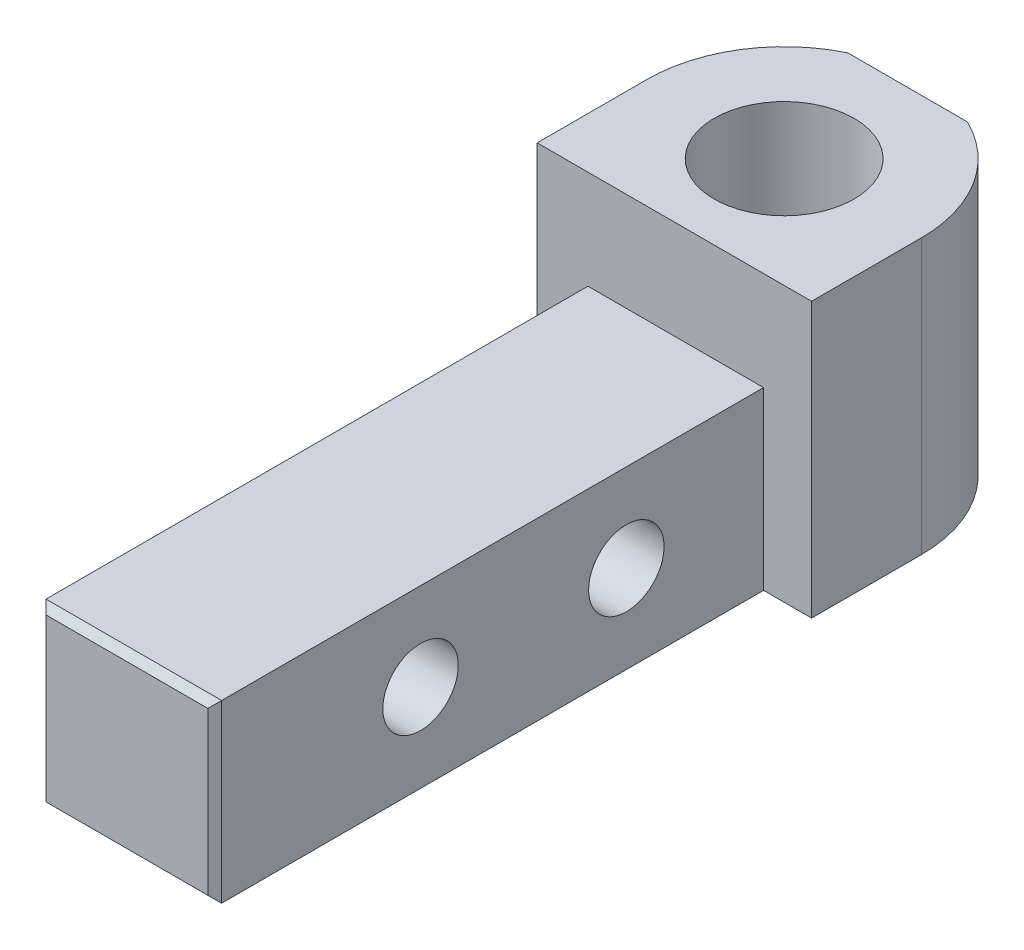
ISO-10303-21;
HEADER;
FILE_DESCRIPTION(('STEP AP214'),'2;1');
FILE_NAME('part.step','',(''),(''),'','','');
FILE_SCHEMA(('AUTOMOTIVE_DESIGN { 1 0 10303 214 1 1 1 1 }'));
ENDSEC;
DATA;
#1=APPLICATION_CONTEXT('core data for automotive mechanical design processes');
#2=APPLICATION_PROTOCOL_DEFINITION('international standard','automotive_design',2000,#1);
#3=PRODUCT_CONTEXT('',#1,'mechanical');
#4=PRODUCT('Part','Part','',(#3));
#5=PRODUCT_RELATED_PRODUCT_CATEGORY('part','',(#4));
#6=PRODUCT_DEFINITION_FORMATION('','',#4);
#7=PRODUCT_DEFINITION_CONTEXT('part definition',#1,'design');
#8=PRODUCT_DEFINITION('design','',#6,#7);
#9=PRODUCT_DEFINITION_SHAPE('','',#8);
#10=(LENGTH_UNIT() NAMED_UNIT(*) SI_UNIT(.MILLI.,.METRE.));
#11=(NAMED_UNIT(*) PLANE_ANGLE_UNIT() SI_UNIT($,.RADIAN.));
#12=(NAMED_UNIT(*) SI_UNIT($,.STERADIAN.) SOLID_ANGLE_UNIT());
#13=UNCERTAINTY_MEASURE_WITH_UNIT(LENGTH_MEASURE(1.E-05),#10,'distance_accuracy_value','');
#14=(GEOMETRIC_REPRESENTATION_CONTEXT(3) GLOBAL_UNCERTAINTY_ASSIGNED_CONTEXT((#13)) GLOBAL_UNIT_ASSIGNED_CONTEXT((#10,
#11,#12)) REPRESENTATION_CONTEXT('',''));
#15=CARTESIAN_POINT('',(0.,0.,0.));
#16=DIRECTION('',(0.,0.,1.));
#17=DIRECTION('',(1.,0.,0.));
#18=AXIS2_PLACEMENT_3D('',#15,#16,#17);
#19=CARTESIAN_POINT('',(-6.3,-6.3,8.));
#20=DIRECTION('',(-1.,0.,0.));
#21=DIRECTION('',(0.,0.,-1.));
#22=AXIS2_PLACEMENT_3D('',#19,#20,#21);
#23=PLANE('',#22);
#24=CARTESIAN_POINT('',(-6.3,0.1,33.));
#25=DIRECTION('',(1.,0.,0.));
#26=DIRECTION('',(0.,0.,-1.));
#27=AXIS2_PLACEMENT_3D('',#24,#25,#26);
#28=CIRCLE('',#27,2.75);
#29=CARTESIAN_POINT('',(-6.3,0.1,30.25));
#30=VERTEX_POINT('',#29);
#31=EDGE_CURVE('E541',#30,#30,#28,.T.);
#32=ORIENTED_EDGE('',*,*,#31,.T.);
#33=EDGE_LOOP('',(#32));
#34=FACE_BOUND('',#33,.T.);
#35=CARTESIAN_POINT('',(-6.3,0.1,18.));
#36=DIRECTION('',(1.,0.,0.));
#37=DIRECTION('',(0.,0.,-1.));
#38=AXIS2_PLACEMENT_3D('',#35,#36,#37);
#39=CIRCLE('',#38,2.75);
#40=CARTESIAN_POINT('',(-6.3,0.1,15.25));
#41=VERTEX_POINT('',#40);
#42=EDGE_CURVE('E553',#41,#41,#39,.T.);
#43=ORIENTED_EDGE('',*,*,#42,.T.);
#44=EDGE_LOOP('',(#43));
#45=FACE_BOUND('',#44,.T.);
#46=DIRECTION('',(0.,0.,1.));
#47=VECTOR('',#46,1.);
#48=CARTESIAN_POINT('',(-6.3,6.5,8.));
#49=LINE('',#48,#47);
#50=CARTESIAN_POINT('',(-6.3,6.5,8.));
#51=VERTEX_POINT('',#50);
#52=CARTESIAN_POINT('',(-6.3,6.5,47.5));
#53=VERTEX_POINT('',#52);
#54=EDGE_CURVE('E153',#51,#53,#49,.T.);
#55=ORIENTED_EDGE('',*,*,#54,.F.);
#56=DIRECTION('',(0.,1.,0.));
#57=VECTOR('',#56,1.);
#58=CARTESIAN_POINT('',(-6.3,-6.3,8.));
#59=LINE('',#58,#57);
#60=CARTESIAN_POINT('',(-6.3,-6.3,8.));
#61=VERTEX_POINT('',#60);
#62=EDGE_CURVE('E147',#61,#51,#59,.T.);
#63=ORIENTED_EDGE('',*,*,#62,.F.);
#64=DIRECTION('',(0.,0.,-1.));
#65=VECTOR('',#64,1.);
#66=CARTESIAN_POINT('',(-6.3,-6.3,8.));
#67=LINE('',#66,#65);
#68=CARTESIAN_POINT('',(-6.3,-6.3,47.5));
#69=VERTEX_POINT('',#68);
#70=EDGE_CURVE('E604',#69,#61,#67,.T.);
#71=ORIENTED_EDGE('',*,*,#70,.F.);
#72=DIRECTION('',(0.,-1.,0.));
#73=VECTOR('',#72,1.);
#74=CARTESIAN_POINT('',(-6.3,-6.3,47.5));
#75=LINE('',#74,#73);
#76=EDGE_CURVE('E12',#53,#69,#75,.T.);
#77=ORIENTED_EDGE('',*,*,#76,.F.);
#78=EDGE_LOOP('',(#55,#63,#71,#77));
#79=FACE_BOUND('',#78,.T.);
#80=ADVANCED_FACE('F19',(#34,#45,#79),#23,.T.);
#81=CARTESIAN_POINT('',(-6.3,-6.3,48.));
#82=DIRECTION('',(0.,0.,1.));
#83=DIRECTION('',(-1.,0.,0.));
#84=AXIS2_PLACEMENT_3D('',#81,#82,#83);
#85=PLANE('',#84);
#86=DIRECTION('',(0.,-1.,0.));
#87=VECTOR('',#86,1.);
#88=CARTESIAN_POINT('',(6.,-6.3,48.));
#89=LINE('',#88,#87);
#90=CARTESIAN_POINT('',(6.,6.,48.));
#91=VERTEX_POINT('',#90);
#92=CARTESIAN_POINT('',(6.,-5.8,48.));
#93=VERTEX_POINT('',#92);
#94=EDGE_CURVE('E271',#91,#93,#89,.T.);
#95=ORIENTED_EDGE('',*,*,#94,.F.);
#96=DIRECTION('',(1.,0.,0.));
#97=VECTOR('',#96,1.);
#98=CARTESIAN_POINT('',(-6.3,6.,48.));
#99=LINE('',#98,#97);
#100=CARTESIAN_POINT('',(-5.8,6.,48.));
#101=VERTEX_POINT('',#100);
#102=EDGE_CURVE('E276',#101,#91,#99,.T.);
#103=ORIENTED_EDGE('',*,*,#102,.F.);
#104=DIRECTION('',(0.,1.,0.));
#105=VECTOR('',#104,1.);
#106=CARTESIAN_POINT('',(-5.8,-6.3,48.));
#107=LINE('',#106,#105);
#108=CARTESIAN_POINT('',(-5.8,-5.8,48.));
#109=VERTEX_POINT('',#108);
#110=EDGE_CURVE('E203',#109,#101,#107,.T.);
#111=ORIENTED_EDGE('',*,*,#110,.F.);
#112=DIRECTION('',(-1.,0.,0.));
#113=VECTOR('',#112,1.);
#114=CARTESIAN_POINT('',(-6.3,-5.8,48.));
#115=LINE('',#114,#113);
#116=EDGE_CURVE('E281',#93,#109,#115,.T.);
#117=ORIENTED_EDGE('',*,*,#116,.F.);
#118=EDGE_LOOP('',(#95,#103,#111,#117));
#119=FACE_BOUND('',#118,.T.);
#120=ADVANCED_FACE('F234',(#119),#85,.T.);
#121=CARTESIAN_POINT('',(6.5,-6.3,48.));
#122=DIRECTION('',(1.,0.,0.));
#123=DIRECTION('',(0.,0.,1.));
#124=AXIS2_PLACEMENT_3D('',#121,#122,#123);
#125=PLANE('',#124);
#126=CARTESIAN_POINT('',(6.5,0.1,33.));
#127=DIRECTION('',(-1.,0.,0.));
#128=DIRECTION('',(0.,0.,1.));
#129=AXIS2_PLACEMENT_3D('',#126,#127,#128);
#130=CIRCLE('',#129,2.75);
#131=CARTESIAN_POINT('',(6.5,0.1,35.75));
#132=VERTEX_POINT('',#131);
#133=EDGE_CURVE('E274',#132,#132,#130,.T.);
#134=ORIENTED_EDGE('',*,*,#133,.T.);
#135=EDGE_LOOP('',(#134));
#136=FACE_BOUND('',#135,.T.);
#137=CARTESIAN_POINT('',(6.5,0.1,18.));
#138=DIRECTION('',(-1.,0.,0.));
#139=DIRECTION('',(0.,0.,1.));
#140=AXIS2_PLACEMENT_3D('',#137,#138,#139);
#141=CIRCLE('',#140,2.75);
#142=CARTESIAN_POINT('',(6.5,0.1,20.75));
#143=VERTEX_POINT('',#142);
#144=EDGE_CURVE('E547',#143,#143,#141,.T.);
#145=ORIENTED_EDGE('',*,*,#144,.T.);
#146=EDGE_LOOP('',(#145));
#147=FACE_BOUND('',#146,.T.);
#148=DIRECTION('',(0.,0.,1.));
#149=VECTOR('',#148,1.);
#150=CARTESIAN_POINT('',(6.5,-6.3,48.));
#151=LINE('',#150,#149);
#152=CARTESIAN_POINT('',(6.5,-6.3,8.));
#153=VERTEX_POINT('',#152);
#154=CARTESIAN_POINT('',(6.5,-6.3,47.5));
#155=VERTEX_POINT('',#154);
#156=EDGE_CURVE('E166',#153,#155,#151,.T.);
#157=ORIENTED_EDGE('',*,*,#156,.F.);
#158=DIRECTION('',(0.,1.,0.));
#159=VECTOR('',#158,1.);
#160=CARTESIAN_POINT('',(6.5,-6.3,8.));
#161=LINE('',#160,#159);
#162=CARTESIAN_POINT('',(6.5,6.5,8.));
#163=VERTEX_POINT('',#162);
#164=EDGE_CURVE('E144',#153,#163,#161,.T.);
#165=ORIENTED_EDGE('',*,*,#164,.T.);
#166=DIRECTION('',(0.,0.,-1.));
#167=VECTOR('',#166,1.);
#168=CARTESIAN_POINT('',(6.5,6.5,8.));
#169=LINE('',#168,#167);
#170=CARTESIAN_POINT('',(6.5,6.5,47.5));
#171=VERTEX_POINT('',#170);
#172=EDGE_CURVE('E156',#171,#163,#169,.T.);
#173=ORIENTED_EDGE('',*,*,#172,.F.);
#174=DIRECTION('',(0.,1.,0.));
#175=VECTOR('',#174,1.);
#176=CARTESIAN_POINT('',(6.5,-6.3,47.5));
#177=LINE('',#176,#175);
#178=EDGE_CURVE('E272',#155,#171,#177,.T.);
#179=ORIENTED_EDGE('',*,*,#178,.F.);
#180=EDGE_LOOP('',(#157,#165,#173,#179));
#181=FACE_BOUND('',#180,.T.);
#182=ADVANCED_FACE('F164',(#136,#147,#181),#125,.T.);
#183=CARTESIAN_POINT('',(0.,-6.3,0.));
#184=DIRECTION('',(0.,1.,0.));
#185=DIRECTION('',(0.,0.,-1.));
#186=AXIS2_PLACEMENT_3D('',#183,#184,#185);
#187=CYLINDRICAL_SURFACE('',#186,10.);
#188=DIRECTION('',(0.,1.,0.));
#189=VECTOR('',#188,1.);
#190=CARTESIAN_POINT('',(-4.35889894354067,-6.3,-9.));
#191=LINE('',#190,#189);
#192=CARTESIAN_POINT('',(-4.35889894354067,-6.3,-9.));
#193=VERTEX_POINT('',#192);
#194=CARTESIAN_POINT('',(-4.35889894354067,13.7,-9.));
#195=VERTEX_POINT('',#194);
#196=EDGE_CURVE('E187',#193,#195,#191,.T.);
#197=ORIENTED_EDGE('',*,*,#196,.F.);
#198=CARTESIAN_POINT('',(0.,-6.3,0.));
#199=DIRECTION('',(0.,-1.,0.));
#200=DIRECTION('',(0.,0.,-1.));
#201=AXIS2_PLACEMENT_3D('',#198,#199,#200);
#202=CIRCLE('',#201,10.);
#203=CARTESIAN_POINT('',(-10.,-6.3,0.));
#204=VERTEX_POINT('',#203);
#205=EDGE_CURVE('E586',#204,#193,#202,.T.);
#206=ORIENTED_EDGE('',*,*,#205,.F.);
#207=DIRECTION('',(0.,1.,0.));
#208=VECTOR('',#207,1.);
#209=CARTESIAN_POINT('',(-10.,-6.3,0.));
#210=LINE('',#209,#208);
#211=CARTESIAN_POINT('',(-10.,13.7,0.));
#212=VERTEX_POINT('',#211);
#213=EDGE_CURVE('E613',#204,#212,#210,.T.);
#214=ORIENTED_EDGE('',*,*,#213,.T.);
#215=CARTESIAN_POINT('',(0.,13.7,0.));
#216=DIRECTION('',(0.,-1.,0.));
#217=DIRECTION('',(0.,0.,-1.));
#218=AXIS2_PLACEMENT_3D('',#215,#216,#217);
#219=CIRCLE('',#218,10.);
#220=EDGE_CURVE('E152',#212,#195,#219,.T.);
#221=ORIENTED_EDGE('',*,*,#220,.T.);
#222=EDGE_LOOP('',(#197,#206,#214,#221));
#223=FACE_BOUND('',#222,.T.);
#224=ADVANCED_FACE('F227',(#223),#187,.T.);
#225=CARTESIAN_POINT('',(-10.,-6.3,0.));
#226=DIRECTION('',(-1.,0.,0.));
#227=DIRECTION('',(0.,0.,-1.));
#228=AXIS2_PLACEMENT_3D('',#225,#226,#227);
#229=PLANE('',#228);
#230=ORIENTED_EDGE('',*,*,#213,.F.);
#231=DIRECTION('',(0.,0.,-1.));
#232=VECTOR('',#231,1.);
#233=CARTESIAN_POINT('',(-10.,-6.3,0.));
#234=LINE('',#233,#232);
#235=CARTESIAN_POINT('',(-10.,-6.3,8.));
#236=VERTEX_POINT('',#235);
#237=EDGE_CURVE('E191',#236,#204,#234,.T.);
#238=ORIENTED_EDGE('',*,*,#237,.F.);
#239=DIRECTION('',(0.,1.,0.));
#240=VECTOR('',#239,1.);
#241=CARTESIAN_POINT('',(-10.,-6.3,8.));
#242=LINE('',#241,#240);
#243=CARTESIAN_POINT('',(-10.,13.7,8.));
#244=VERTEX_POINT('',#243);
#245=EDGE_CURVE('E173',#236,#244,#242,.T.);
#246=ORIENTED_EDGE('',*,*,#245,.T.);
#247=DIRECTION('',(0.,0.,-1.));
#248=VECTOR('',#247,1.);
#249=CARTESIAN_POINT('',(-10.,13.7,0.));
#250=LINE('',#249,#248);
#251=EDGE_CURVE('E583',#244,#212,#250,.T.);
#252=ORIENTED_EDGE('',*,*,#251,.T.);
#253=EDGE_LOOP('',(#230,#238,#246,#252));
#254=FACE_BOUND('',#253,.T.);
#255=ADVANCED_FACE('F224',(#254),#229,.T.);
#256=CARTESIAN_POINT('',(-10.,-6.3,8.));
#257=DIRECTION('',(0.,0.,1.));
#258=DIRECTION('',(-1.,0.,0.));
#259=AXIS2_PLACEMENT_3D('',#256,#257,#258);
#260=PLANE('',#259);
#261=ORIENTED_EDGE('',*,*,#245,.F.);
#262=DIRECTION('',(-1.,0.,0.));
#263=VECTOR('',#262,1.);
#264=CARTESIAN_POINT('',(-10.,-6.3,8.));
#265=LINE('',#264,#263);
#266=EDGE_CURVE('E608',#61,#236,#265,.T.);
#267=ORIENTED_EDGE('',*,*,#266,.F.);
#268=ORIENTED_EDGE('',*,*,#62,.T.);
#269=DIRECTION('',(-1.,0.,0.));
#270=VECTOR('',#269,1.);
#271=CARTESIAN_POINT('',(-6.3,6.5,8.));
#272=LINE('',#271,#270);
#273=EDGE_CURVE('E138',#163,#51,#272,.T.);
#274=ORIENTED_EDGE('',*,*,#273,.F.);
#275=ORIENTED_EDGE('',*,*,#164,.F.);
#276=DIRECTION('',(-1.,0.,0.));
#277=VECTOR('',#276,1.);
#278=CARTESIAN_POINT('',(6.5,-6.3,8.));
#279=LINE('',#278,#277);
#280=CARTESIAN_POINT('',(10.,-6.3,8.));
#281=VERTEX_POINT('',#280);
#282=EDGE_CURVE('E599',#281,#153,#279,.T.);
#283=ORIENTED_EDGE('',*,*,#282,.F.);
#284=DIRECTION('',(0.,1.,0.));
#285=VECTOR('',#284,1.);
#286=CARTESIAN_POINT('',(10.,-6.3,8.));
#287=LINE('',#286,#285);
#288=CARTESIAN_POINT('',(10.,13.7,8.));
#289=VERTEX_POINT('',#288);
#290=EDGE_CURVE('E168',#281,#289,#287,.T.);
#291=ORIENTED_EDGE('',*,*,#290,.T.);
#292=DIRECTION('',(-1.,0.,0.));
#293=VECTOR('',#292,1.);
#294=CARTESIAN_POINT('',(6.5,13.7,8.));
#295=LINE('',#294,#293);
#296=EDGE_CURVE('E580',#289,#244,#295,.T.);
#297=ORIENTED_EDGE('',*,*,#296,.T.);
#298=EDGE_LOOP('',(#261,#267,#268,#274,#275,#283,#291,#297));
#299=FACE_BOUND('',#298,.T.);
#300=ADVANCED_FACE('F141',(#299),#260,.T.);
#301=CARTESIAN_POINT('',(10.,-6.3,8.));
#302=DIRECTION('',(1.,0.,0.));
#303=DIRECTION('',(0.,0.,1.));
#304=AXIS2_PLACEMENT_3D('',#301,#302,#303);
#305=PLANE('',#304);
#306=ORIENTED_EDGE('',*,*,#290,.F.);
#307=DIRECTION('',(0.,0.,1.));
#308=VECTOR('',#307,1.);
#309=CARTESIAN_POINT('',(10.,-6.3,8.));
#310=LINE('',#309,#308);
#311=CARTESIAN_POINT('',(10.,-6.3,0.));
#312=VERTEX_POINT('',#311);
#313=EDGE_CURVE('E596',#312,#281,#310,.T.);
#314=ORIENTED_EDGE('',*,*,#313,.F.);
#315=DIRECTION('',(0.,1.,0.));
#316=VECTOR('',#315,1.);
#317=CARTESIAN_POINT('',(10.,-6.3,0.));
#318=LINE('',#317,#316);
#319=CARTESIAN_POINT('',(10.,13.7,0.));
#320=VERTEX_POINT('',#319);
#321=EDGE_CURVE('E176',#312,#320,#318,.T.);
#322=ORIENTED_EDGE('',*,*,#321,.T.);
#323=DIRECTION('',(0.,0.,1.));
#324=VECTOR('',#323,1.);
#325=CARTESIAN_POINT('',(10.,13.7,8.));
#326=LINE('',#325,#324);
#327=EDGE_CURVE('E577',#320,#289,#326,.T.);
#328=ORIENTED_EDGE('',*,*,#327,.T.);
#329=EDGE_LOOP('',(#306,#314,#322,#328));
#330=FACE_BOUND('',#329,.T.);
#331=ADVANCED_FACE('F231',(#330),#305,.T.);
#332=CARTESIAN_POINT('',(0.,-6.3,0.));
#333=DIRECTION('',(0.,1.,0.));
#334=DIRECTION('',(0.,0.,-1.));
#335=AXIS2_PLACEMENT_3D('',#332,#333,#334);
#336=CYLINDRICAL_SURFACE('',#335,10.);
#337=ORIENTED_EDGE('',*,*,#321,.F.);
#338=CARTESIAN_POINT('',(0.,-6.3,0.));
#339=DIRECTION('',(0.,-1.,0.));
#340=DIRECTION('',(0.,0.,1.));
#341=AXIS2_PLACEMENT_3D('',#338,#339,#340);
#342=CIRCLE('',#341,10.);
#343=CARTESIAN_POINT('',(4.35889894354067,-6.3,-9.));
#344=VERTEX_POINT('',#343);
#345=EDGE_CURVE('E593',#344,#312,#342,.T.);
#346=ORIENTED_EDGE('',*,*,#345,.F.);
#347=DIRECTION('',(0.,1.,0.));
#348=VECTOR('',#347,1.);
#349=CARTESIAN_POINT('',(4.35889894354067,-6.3,-9.));
#350=LINE('',#349,#348);
#351=CARTESIAN_POINT('',(4.35889894354067,13.7,-9.));
#352=VERTEX_POINT('',#351);
#353=EDGE_CURVE('E183',#344,#352,#350,.T.);
#354=ORIENTED_EDGE('',*,*,#353,.T.);
#355=CARTESIAN_POINT('',(0.,13.7,0.));
#356=DIRECTION('',(0.,-1.,0.));
#357=DIRECTION('',(0.,0.,1.));
#358=AXIS2_PLACEMENT_3D('',#355,#356,#357);
#359=CIRCLE('',#358,10.);
#360=EDGE_CURVE('E574',#352,#320,#359,.T.);
#361=ORIENTED_EDGE('',*,*,#360,.T.);
#362=EDGE_LOOP('',(#337,#346,#354,#361));
#363=FACE_BOUND('',#362,.T.);
#364=ADVANCED_FACE('F244',(#363),#336,.T.);
#365=CARTESIAN_POINT('',(-4.35889894354067,-6.3,-9.));
#366=DIRECTION('',(0.,0.,-1.));
#367=DIRECTION('',(1.,0.,0.));
#368=AXIS2_PLACEMENT_3D('',#365,#366,#367);
#369=PLANE('',#368);
#370=CARTESIAN_POINT('',(0.,0.,-9.));
#371=DIRECTION('',(0.,0.,1.));
#372=DIRECTION('',(1.,0.,0.));
#373=AXIS2_PLACEMENT_3D('',#370,#371,#372);
#374=CIRCLE('',#373,1.65);
#375=CARTESIAN_POINT('',(1.65,0.,-9.));
#376=VERTEX_POINT('',#375);
#377=EDGE_CURVE('E202',#376,#376,#374,.T.);
#378=ORIENTED_EDGE('',*,*,#377,.T.);
#379=EDGE_LOOP('',(#378));
#380=FACE_BOUND('',#379,.T.);
#381=ORIENTED_EDGE('',*,*,#353,.F.);
#382=DIRECTION('',(1.,0.,0.));
#383=VECTOR('',#382,1.);
#384=CARTESIAN_POINT('',(-4.35889894354067,-6.3,-9.));
#385=LINE('',#384,#383);
#386=EDGE_CURVE('E590',#193,#344,#385,.T.);
#387=ORIENTED_EDGE('',*,*,#386,.F.);
#388=ORIENTED_EDGE('',*,*,#196,.T.);
#389=DIRECTION('',(1.,0.,0.));
#390=VECTOR('',#389,1.);
#391=CARTESIAN_POINT('',(-4.35889894354067,13.7,-9.));
#392=LINE('',#391,#390);
#393=EDGE_CURVE('E571',#195,#352,#392,.T.);
#394=ORIENTED_EDGE('',*,*,#393,.T.);
#395=EDGE_LOOP('',(#381,#387,#388,#394));
#396=FACE_BOUND('',#395,.T.);
#397=ADVANCED_FACE('F222',(#380,#396),#369,.T.);
#398=CARTESIAN_POINT('',(0.,-6.3,0.));
#399=DIRECTION('',(0.,1.,0.));
#400=DIRECTION('',(0.,0.,-1.));
#401=AXIS2_PLACEMENT_3D('',#398,#399,#400);
#402=PLANE('',#401);
#403=CARTESIAN_POINT('',(0.,-6.3,0.));
#404=DIRECTION('',(0.,-1.,0.));
#405=DIRECTION('',(0.,0.,-1.));
#406=AXIS2_PLACEMENT_3D('',#403,#404,#405);
#407=CIRCLE('',#406,5.1);
#408=CARTESIAN_POINT('',(0.,-6.3,-5.1));
#409=VERTEX_POINT('',#408);
#410=EDGE_CURVE('E162',#409,#409,#407,.T.);
#411=ORIENTED_EDGE('',*,*,#410,.F.);
#412=EDGE_LOOP('',(#411));
#413=FACE_BOUND('',#412,.T.);
#414=ORIENTED_EDGE('',*,*,#70,.T.);
#415=ORIENTED_EDGE('',*,*,#266,.T.);
#416=ORIENTED_EDGE('',*,*,#237,.T.);
#417=ORIENTED_EDGE('',*,*,#205,.T.);
#418=ORIENTED_EDGE('',*,*,#386,.T.);
#419=ORIENTED_EDGE('',*,*,#345,.T.);
#420=ORIENTED_EDGE('',*,*,#313,.T.);
#421=ORIENTED_EDGE('',*,*,#282,.T.);
#422=ORIENTED_EDGE('',*,*,#156,.T.);
#423=DIRECTION('',(1.,0.,0.));
#424=VECTOR('',#423,1.);
#425=CARTESIAN_POINT('',(6.5,-6.3,47.5));
#426=LINE('',#425,#424);
#427=EDGE_CURVE('E286',#69,#155,#426,.T.);
#428=ORIENTED_EDGE('',*,*,#427,.F.);
#429=EDGE_LOOP('',(#414,#415,#416,#417,#418,#419,#420,#421,#422,#428));
#430=FACE_BOUND('',#429,.T.);
#431=ADVANCED_FACE('F218',(#413,#430),#402,.F.);
#432=CARTESIAN_POINT('',(0.,13.7,0.));
#433=DIRECTION('',(0.,1.,0.));
#434=DIRECTION('',(0.,0.,-1.));
#435=AXIS2_PLACEMENT_3D('',#432,#433,#434);
#436=PLANE('',#435);
#437=CARTESIAN_POINT('',(0.,13.7,0.));
#438=DIRECTION('',(0.,-1.,0.));
#439=DIRECTION('',(0.,0.,-1.));
#440=AXIS2_PLACEMENT_3D('',#437,#438,#439);
#441=CIRCLE('',#440,5.1);
#442=CARTESIAN_POINT('',(0.,13.7,-5.1));
#443=VERTEX_POINT('',#442);
#444=EDGE_CURVE('E201',#443,#443,#441,.T.);
#445=ORIENTED_EDGE('',*,*,#444,.T.);
#446=EDGE_LOOP('',(#445));
#447=FACE_BOUND('',#446,.T.);
#448=ORIENTED_EDGE('',*,*,#296,.F.);
#449=ORIENTED_EDGE('',*,*,#327,.F.);
#450=ORIENTED_EDGE('',*,*,#360,.F.);
#451=ORIENTED_EDGE('',*,*,#393,.F.);
#452=ORIENTED_EDGE('',*,*,#220,.F.);
#453=ORIENTED_EDGE('',*,*,#251,.F.);
#454=EDGE_LOOP('',(#448,#449,#450,#451,#452,#453));
#455=FACE_BOUND('',#454,.T.);
#456=ADVANCED_FACE('F215',(#447,#455),#436,.T.);
#457=CARTESIAN_POINT('',(0.,6.5,0.));
#458=DIRECTION('',(0.,1.,0.));
#459=DIRECTION('',(0.,0.,-1.));
#460=AXIS2_PLACEMENT_3D('',#457,#458,#459);
#461=PLANE('',#460);
#462=ORIENTED_EDGE('',*,*,#172,.T.);
#463=ORIENTED_EDGE('',*,*,#273,.T.);
#464=ORIENTED_EDGE('',*,*,#54,.T.);
#465=DIRECTION('',(-1.,0.,0.));
#466=VECTOR('',#465,1.);
#467=CARTESIAN_POINT('',(0.,6.5,47.5));
#468=LINE('',#467,#466);
#469=EDGE_CURVE('E29',#171,#53,#468,.T.);
#470=ORIENTED_EDGE('',*,*,#469,.F.);
#471=EDGE_LOOP('',(#462,#463,#464,#470));
#472=FACE_BOUND('',#471,.T.);
#473=ADVANCED_FACE('F157',(#472),#461,.T.);
#474=CARTESIAN_POINT('',(0.,-6.3,0.));
#475=DIRECTION('',(0.,1.,0.));
#476=DIRECTION('',(0.,0.,-1.));
#477=AXIS2_PLACEMENT_3D('',#474,#475,#476);
#478=CYLINDRICAL_SURFACE('',#477,5.1);
#479=CARTESIAN_POINT('',(0.,-1.65,-5.1));
#480=CARTESIAN_POINT('',(0.0901776614808582,-1.64999991724303,-5.09999989559306));
#481=CARTESIAN_POINT('',(0.180356972847911,-1.64258305864693,-5.09758592619714));
#482=CARTESIAN_POINT('',(0.358068395597842,-1.61319612974968,-5.08819328432072));
#483=CARTESIAN_POINT('',(0.445600076230389,-1.59122370453862,-5.08121387321073));
#484=CARTESIAN_POINT('',(0.615428303951314,-1.53355129359994,-5.06345067384313));
#485=CARTESIAN_POINT('',(0.697733046833123,-1.49787344981802,-5.05267302418079));
#486=CARTESIAN_POINT('',(0.855191272956865,-1.41390024649627,-5.02841947915375));
#487=CARTESIAN_POINT('',(0.930343474108597,-1.36560263065681,-5.01494310138192));
#488=CARTESIAN_POINT('',(1.07383243135771,-1.25609259765029,-4.98622102100592));
#489=CARTESIAN_POINT('',(1.14190149341658,-1.19454011926924,-4.97093474423422));
#490=CARTESIAN_POINT('',(1.26695278284405,-1.06099109902543,-4.94054451364169));
#491=CARTESIAN_POINT('',(1.32393275390365,-0.988992436857797,-4.92544059751114));
#492=CARTESIAN_POINT('',(1.42667968412869,-0.834229179766327,-4.89668410363578));
#493=CARTESIAN_POINT('',(1.47210516214056,-0.751227747343887,-4.88308127746682));
#494=CARTESIAN_POINT('',(1.548239665767,-0.578252272891914,-4.85948086641644));
#495=CARTESIAN_POINT('',(1.57895288651625,-0.488280227012973,-4.849482254011));
#496=CARTESIAN_POINT('',(1.62379858311779,-0.306950751462824,-4.83464823078889));
#497=CARTESIAN_POINT('',(1.63843030324966,-0.215729839601685,-4.82965780181445));
#498=CARTESIAN_POINT('',(1.65225792355693,-0.0320018639746396,-4.82494581465085));
#499=CARTESIAN_POINT('',(1.65145827018593,0.0605048216266334,-4.82522273870659));
#500=CARTESIAN_POINT('',(1.63483482678179,0.239982620591167,-4.83087784831818));
#501=CARTESIAN_POINT('',(1.61965437715618,0.327021381212629,-4.83603758564445));
#502=CARTESIAN_POINT('',(1.57574669451346,0.497243134425127,-4.85052073033937));
#503=CARTESIAN_POINT('',(1.54701792713897,0.580425689125702,-4.85984460929391));
#504=CARTESIAN_POINT('',(1.4763922566661,0.742069205914025,-4.88176670200889));
#505=CARTESIAN_POINT('',(1.43429932207923,0.82043769498142,-4.89441314277424));
#506=CARTESIAN_POINT('',(1.33827627860316,0.969205996085412,-4.9215343171624));
#507=CARTESIAN_POINT('',(1.28434291239819,1.03960360723115,-4.93600955342275));
#508=CARTESIAN_POINT('',(1.1630480927749,1.17405756954811,-4.96602485362883));
#509=CARTESIAN_POINT('',(1.09515819281223,1.23763423239022,-4.98158234064024));
#510=CARTESIAN_POINT('',(0.949487621327104,1.35262125592973,-5.01138636209078));
#511=CARTESIAN_POINT('',(0.871706108899586,1.40403058119394,-5.02563278489612));
#512=CARTESIAN_POINT('',(0.707487389071952,1.49358024697329,-5.05137809450472));
#513=CARTESIAN_POINT('',(0.620979513912725,1.53159882473936,-5.06285148511762));
#514=CARTESIAN_POINT('',(0.442337274129458,1.59239820035616,-5.08157345766546));
#515=CARTESIAN_POINT('',(0.350204756734489,1.61518397185453,-5.08882341848851));
#516=CARTESIAN_POINT('',(0.166994601074295,1.64403676836006,-5.09805635124521));
#517=CARTESIAN_POINT('',(0.0760292804358794,1.65075253951643,-5.10024357980207));
#518=CARTESIAN_POINT('',(-0.105742381291132,1.64911368997447,-5.09971314230831));
#519=CARTESIAN_POINT('',(-0.196548745206381,1.64076144777126,-5.09699625037609));
#520=CARTESIAN_POINT('',(-0.372873369424455,1.60974070083744,-5.08709741420676));
#521=CARTESIAN_POINT('',(-0.458468204122838,1.58746457297934,-5.08003792860974));
#522=CARTESIAN_POINT('',(-0.624676289140704,1.5297133185559,-5.06228912237962));
#523=CARTESIAN_POINT('',(-0.705288910971593,1.4942365307206,-5.05159934489816));
#524=CARTESIAN_POINT('',(-0.861526428689452,1.41008692106376,-5.02734374954101));
#525=CARTESIAN_POINT('',(-0.936972406761221,1.36110153036141,-5.01371171997128));
#526=CARTESIAN_POINT('',(-1.07878765233756,1.25169608651492,-4.98512378170962));
#527=CARTESIAN_POINT('',(-1.14515428365307,1.19127272444235,-4.97016749058576));
#528=CARTESIAN_POINT('',(-1.26986961530234,1.05765456233189,-4.93981067357683));
#529=CARTESIAN_POINT('',(-1.32775553235685,0.984024918395042,-4.9244184127533));
#530=CARTESIAN_POINT('',(-1.43039974664611,0.827764102689396,-4.89559072459264));
#531=CARTESIAN_POINT('',(-1.47515809948365,0.745132969049124,-4.88215528896736));
#532=CARTESIAN_POINT('',(-1.5500319651711,0.573284709112858,-4.85890343319685));
#533=CARTESIAN_POINT('',(-1.58019115253847,0.484088157806711,-4.84907624028989));
#534=CARTESIAN_POINT('',(-1.62493896651959,0.301495018256697,-4.83426723759408));
#535=CARTESIAN_POINT('',(-1.63953407759558,0.208100196053914,-4.8292834099904));
#536=CARTESIAN_POINT('',(-1.65225238730678,0.0246279558270292,-4.82494583192055));
#537=CARTESIAN_POINT('',(-1.65113936347207,-0.0653909650989491,-4.82533101216338));
#538=CARTESIAN_POINT('',(-1.6343355739116,-0.243889548226916,-4.83104793835509));
#539=CARTESIAN_POINT('',(-1.61864558293727,-0.332369291980051,-4.83637942141282));
#540=CARTESIAN_POINT('',(-1.57366020933029,-0.503804041449142,-4.85119943993053));
#541=CARTESIAN_POINT('',(-1.544598371592,-0.58682698868716,-4.86061646463534));
#542=CARTESIAN_POINT('',(-1.47388074339257,-0.746883562414202,-4.88252388305402));
#543=CARTESIAN_POINT('',(-1.4322222643648,-0.82391590588054,-4.89501493276699));
#544=CARTESIAN_POINT('',(-1.33547377006333,-0.973268488126954,-4.9223096642309));
#545=CARTESIAN_POINT('',(-1.2798979758839,-1.04526037590764,-4.93718782239872));
#546=CARTESIAN_POINT('',(-1.15772961708554,-1.17914330143395,-4.96725419696154));
#547=CARTESIAN_POINT('',(-1.09113401966079,-1.24103154917393,-4.98244249770062));
#548=CARTESIAN_POINT('',(-0.945942793218985,-1.35518270274058,-5.01207220993587));
#549=CARTESIAN_POINT('',(-0.867002193347087,-1.40702029895323,-5.02646723358168));
#550=CARTESIAN_POINT('',(-0.701064465826984,-1.49662688289285,-5.05228105004504));
#551=CARTESIAN_POINT('',(-0.614069947675346,-1.53440040764506,-5.06370080231823));
#552=CARTESIAN_POINT('',(-0.440215809054057,-1.59266177024257,-5.08166831848012));
#553=CARTESIAN_POINT('',(-0.353701210773969,-1.6140981371834,-5.08848028309952));
#554=CARTESIAN_POINT('',(-0.178124535621018,-1.64276559614861,-5.09764564285638));
#555=CARTESIAN_POINT('',(-0.0890630724871639,-1.6500000817341,-5.10000010311648));
#556=CARTESIAN_POINT('',(0.,-1.65,-5.1));
#557=B_SPLINE_CURVE_WITH_KNOTS('',3,(#479,#480,#481,#482,#483,#484,#485,#486,#487,#488,#489,
#490,#491,#492,#493,#494,#495,#496,#497,#498,#499,#500,#501,#502,#503,#504,#505,#506,#507,#508,
#509,#510,#511,#512,#513,#514,#515,#516,#517,#518,#519,#520,#521,#522,#523,#524,#525,#526,#527,
#528,#529,#530,#531,#532,#533,#534,#535,#536,#537,#538,#539,#540,#541,#542,#543,#544,#545,#546,
#547,#548,#549,#550,#551,#552,#553,#554,#555,#556),.UNSPECIFIED.,.T.,.F.,(4,2,2,2,2,2,2,2,2,2,2,
2,2,2,2,2,2,2,2,2,2,2,2,2,2,2,2,2,2,2,2,2,2,2,2,2,2,2,4),(0.,0.270205418927547,
0.540454564416287,0.810268929623086,1.0801315682146,1.35798481223378,1.63589453237139,
1.92125315124464,2.20653035286993,2.4826765216373,2.75874312180461,3.02301524363342,
3.2873173016726,3.55569080589859,3.82413823269322,4.10573840591475,4.3873625345336,
4.67148510861697,4.9555148687681,5.22786917632359,5.50018049634676,5.76514403926363,
6.0301409384623,6.30187522096558,6.57368823484542,6.8570959838295,7.14050253240108,
7.42305592701262,7.70549155533496,7.9742436656602,8.2429814928927,8.50719414315908,
8.77146322555741,9.04670256094916,9.32201777247422,9.60721675404268,9.8923236514363,
10.1592531430424,10.4261188436736),.UNSPECIFIED.);
#558=CARTESIAN_POINT('',(0.,-1.65,-5.1));
#559=VERTEX_POINT('',#558);
#560=EDGE_CURVE('E192',#559,#559,#557,.T.);
#561=ORIENTED_EDGE('',*,*,#560,.F.);
#562=EDGE_LOOP('',(#561));
#563=FACE_BOUND('',#562,.T.);
#564=ORIENTED_EDGE('',*,*,#410,.T.);
#565=EDGE_LOOP('',(#564));
#566=FACE_BOUND('',#565,.T.);
#567=ORIENTED_EDGE('',*,*,#444,.F.);
#568=EDGE_LOOP('',(#567));
#569=FACE_BOUND('',#568,.T.);
#570=ADVANCED_FACE('F208',(#563,#566,#569),#478,.F.);
#571=CARTESIAN_POINT('',(0.,0.,-2.));
#572=DIRECTION('',(0.,0.,-1.));
#573=DIRECTION('',(1.,0.,0.));
#574=AXIS2_PLACEMENT_3D('',#571,#572,#573);
#575=CYLINDRICAL_SURFACE('',#574,1.65);
#576=ORIENTED_EDGE('',*,*,#377,.F.);
#577=EDGE_LOOP('',(#576));
#578=FACE_BOUND('',#577,.T.);
#579=ORIENTED_EDGE('',*,*,#560,.T.);
#580=EDGE_LOOP('',(#579));
#581=FACE_BOUND('',#580,.T.);
#582=ADVANCED_FACE('F205',(#578,#581),#575,.F.);
#583=CARTESIAN_POINT('',(-10.,0.1,18.));
#584=DIRECTION('',(1.,0.,0.));
#585=DIRECTION('',(0.,0.,1.));
#586=AXIS2_PLACEMENT_3D('',#583,#584,#585);
#587=CYLINDRICAL_SURFACE('',#586,2.75);
#588=ORIENTED_EDGE('',*,*,#42,.F.);
#589=EDGE_LOOP('',(#588));
#590=FACE_BOUND('',#589,.T.);
#591=ORIENTED_EDGE('',*,*,#144,.F.);
#592=EDGE_LOOP('',(#591));
#593=FACE_BOUND('',#592,.T.);
#594=ADVANCED_FACE('F393',(#590,#593),#587,.F.);
#595=CARTESIAN_POINT('',(-10.,0.1,33.));
#596=DIRECTION('',(1.,0.,0.));
#597=DIRECTION('',(0.,0.,1.));
#598=AXIS2_PLACEMENT_3D('',#595,#596,#597);
#599=CYLINDRICAL_SURFACE('',#598,2.75);
#600=ORIENTED_EDGE('',*,*,#31,.F.);
#601=EDGE_LOOP('',(#600));
#602=FACE_BOUND('',#601,.T.);
#603=ORIENTED_EDGE('',*,*,#133,.F.);
#604=EDGE_LOOP('',(#603));
#605=FACE_BOUND('',#604,.T.);
#606=ADVANCED_FACE('F268',(#602,#605),#599,.F.);
#607=CARTESIAN_POINT('',(-6.3,6.,48.));
#608=DIRECTION('',(0.,-0.707106781186548,-0.707106781186548));
#609=DIRECTION('',(0.,-0.707106781186548,0.707106781186548));
#610=AXIS2_PLACEMENT_3D('',#607,#608,#609);
#611=PLANE('',#610);
#612=DIRECTION('',(0.577350269189626,-0.577350269189626,0.577350269189626));
#613=VECTOR('',#612,1.);
#614=CARTESIAN_POINT('',(-1.7,1.9,52.1));
#615=LINE('',#614,#613);
#616=EDGE_CURVE('E40',#53,#101,#615,.T.);
#617=ORIENTED_EDGE('',*,*,#616,.T.);
#618=ORIENTED_EDGE('',*,*,#102,.T.);
#619=DIRECTION('',(-0.577350269189626,-0.577350269189626,0.577350269189626));
#620=VECTOR('',#619,1.);
#621=CARTESIAN_POINT('',(1.9,1.9,52.1));
#622=LINE('',#621,#620);
#623=EDGE_CURVE('E23',#91,#171,#622,.F.);
#624=ORIENTED_EDGE('',*,*,#623,.T.);
#625=ORIENTED_EDGE('',*,*,#469,.T.);
#626=EDGE_LOOP('',(#617,#618,#624,#625));
#627=FACE_BOUND('',#626,.T.);
#628=ADVANCED_FACE('F21',(#627),#611,.F.);
#629=CARTESIAN_POINT('',(6.5,-6.3,47.5));
#630=DIRECTION('',(-0.707106781186548,0.,-0.707106781186548));
#631=DIRECTION('',(0.707106781186548,0.,-0.707106781186548));
#632=AXIS2_PLACEMENT_3D('',#629,#630,#631);
#633=PLANE('',#632);
#634=ORIENTED_EDGE('',*,*,#623,.F.);
#635=ORIENTED_EDGE('',*,*,#94,.T.);
#636=DIRECTION('',(0.577350269189626,-0.577350269189626,-0.577350269189626));
#637=VECTOR('',#636,1.);
#638=CARTESIAN_POINT('',(6.5,-6.3,47.5));
#639=LINE('',#638,#637);
#640=EDGE_CURVE('E299',#93,#155,#639,.T.);
#641=ORIENTED_EDGE('',*,*,#640,.T.);
#642=ORIENTED_EDGE('',*,*,#178,.T.);
#643=EDGE_LOOP('',(#634,#635,#641,#642));
#644=FACE_BOUND('',#643,.T.);
#645=ADVANCED_FACE('F261',(#644),#633,.F.);
#646=CARTESIAN_POINT('',(-5.8,-6.3,48.));
#647=DIRECTION('',(0.707106781186548,0.,-0.707106781186548));
#648=DIRECTION('',(0.707106781186548,0.,0.707106781186548));
#649=AXIS2_PLACEMENT_3D('',#646,#647,#648);
#650=PLANE('',#649);
#651=ORIENTED_EDGE('',*,*,#616,.F.);
#652=ORIENTED_EDGE('',*,*,#76,.T.);
#653=DIRECTION('',(0.577350269189626,0.577350269189626,0.577350269189626));
#654=VECTOR('',#653,1.);
#655=CARTESIAN_POINT('',(-5.96666666666667,-5.96666666666667,47.8333333333333));
#656=LINE('',#655,#654);
#657=EDGE_CURVE('E296',#69,#109,#656,.T.);
#658=ORIENTED_EDGE('',*,*,#657,.T.);
#659=ORIENTED_EDGE('',*,*,#110,.T.);
#660=EDGE_LOOP('',(#651,#652,#658,#659));
#661=FACE_BOUND('',#660,.T.);
#662=ADVANCED_FACE('F258',(#661),#650,.F.);
#663=CARTESIAN_POINT('',(-6.3,-5.8,48.));
#664=DIRECTION('',(0.,-0.707106781186548,0.707106781186548));
#665=DIRECTION('',(0.,0.707106781186548,0.707106781186548));
#666=AXIS2_PLACEMENT_3D('',#663,#664,#665);
#667=PLANE('',#666);
#668=ORIENTED_EDGE('',*,*,#640,.F.);
#669=ORIENTED_EDGE('',*,*,#116,.T.);
#670=ORIENTED_EDGE('',*,*,#657,.F.);
#671=ORIENTED_EDGE('',*,*,#427,.T.);
#672=EDGE_LOOP('',(#668,#669,#670,#671));
#673=FACE_BOUND('',#672,.T.);
#674=ADVANCED_FACE('F255',(#673),#667,.T.);
#675=CLOSED_SHELL('',(#80,#120,#182,#224,#255,#300,#331,#364,#397,#431,#456,#473,#570,#582,#594,
#606,#628,#645,#662,#674));
#676=MANIFOLD_SOLID_BREP('B1',#675);
#677=ADVANCED_BREP_SHAPE_REPRESENTATION('',(#18,#676),#14);
#678=SHAPE_DEFINITION_REPRESENTATION(#9,#677);
ENDSEC;
END-ISO-10303-21;
